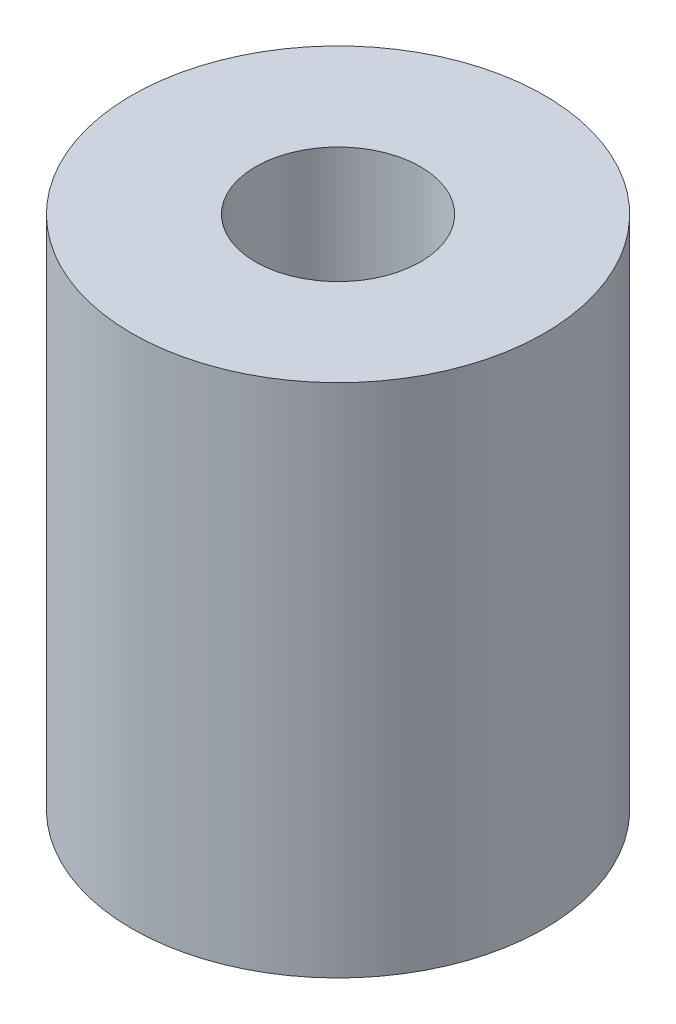
ISO-10303-21;
HEADER;
FILE_DESCRIPTION(('STEP AP214'),'2;1');
FILE_NAME('part.step','',(''),(''),'','','');
FILE_SCHEMA(('AUTOMOTIVE_DESIGN { 1 0 10303 214 1 1 1 1 }'));
ENDSEC;
DATA;
#1=APPLICATION_CONTEXT('core data for automotive mechanical design processes');
#2=APPLICATION_PROTOCOL_DEFINITION('international standard','automotive_design',2000,#1);
#3=PRODUCT_CONTEXT('',#1,'mechanical');
#4=PRODUCT('Part','Part','',(#3));
#5=PRODUCT_RELATED_PRODUCT_CATEGORY('part','',(#4));
#6=PRODUCT_DEFINITION_FORMATION('','',#4);
#7=PRODUCT_DEFINITION_CONTEXT('part definition',#1,'design');
#8=PRODUCT_DEFINITION('design','',#6,#7);
#9=PRODUCT_DEFINITION_SHAPE('','',#8);
#10=(LENGTH_UNIT() NAMED_UNIT(*) SI_UNIT(.MILLI.,.METRE.));
#11=(NAMED_UNIT(*) PLANE_ANGLE_UNIT() SI_UNIT($,.RADIAN.));
#12=(NAMED_UNIT(*) SI_UNIT($,.STERADIAN.) SOLID_ANGLE_UNIT());
#13=UNCERTAINTY_MEASURE_WITH_UNIT(LENGTH_MEASURE(1.E-05),#10,'distance_accuracy_value','');
#14=(GEOMETRIC_REPRESENTATION_CONTEXT(3) GLOBAL_UNCERTAINTY_ASSIGNED_CONTEXT((#13)) GLOBAL_UNIT_ASSIGNED_CONTEXT((#10,
#11,#12)) REPRESENTATION_CONTEXT('',''));
#15=CARTESIAN_POINT('',(0.,0.,0.));
#16=DIRECTION('',(0.,0.,1.));
#17=DIRECTION('',(1.,0.,0.));
#18=AXIS2_PLACEMENT_3D('',#15,#16,#17);
#19=CARTESIAN_POINT('',(0.,12.5,0.));
#20=DIRECTION('',(0.,1.,0.));
#21=DIRECTION('',(0.,0.,1.));
#22=AXIS2_PLACEMENT_3D('',#19,#20,#21);
#23=PLANE('',#22);
#24=CARTESIAN_POINT('',(0.,12.5,0.));
#25=DIRECTION('',(0.,1.,0.));
#26=DIRECTION('',(0.,0.,1.));
#27=AXIS2_PLACEMENT_3D('',#24,#25,#26);
#28=CIRCLE('',#27,2.5);
#29=CARTESIAN_POINT('',(0.,12.5,2.5));
#30=VERTEX_POINT('',#29);
#31=EDGE_CURVE('E41',#30,#30,#28,.T.);
#32=ORIENTED_EDGE('',*,*,#31,.F.);
#33=EDGE_LOOP('',(#32));
#34=FACE_BOUND('',#33,.T.);
#35=CARTESIAN_POINT('',(0.,12.5,0.));
#36=DIRECTION('',(0.,1.,0.));
#37=DIRECTION('',(0.,0.,1.));
#38=AXIS2_PLACEMENT_3D('',#35,#36,#37);
#39=CIRCLE('',#38,4.);
#40=CARTESIAN_POINT('',(0.,12.5,4.));
#41=VERTEX_POINT('',#40);
#42=EDGE_CURVE('E55',#41,#41,#39,.T.);
#43=ORIENTED_EDGE('',*,*,#42,.T.);
#44=EDGE_LOOP('',(#43));
#45=FACE_BOUND('',#44,.T.);
#46=ADVANCED_FACE('F34',(#34,#45),#23,.T.);
#47=CARTESIAN_POINT('',(0.,0.,0.));
#48=DIRECTION('',(0.,1.,0.));
#49=DIRECTION('',(0.,0.,1.));
#50=AXIS2_PLACEMENT_3D('',#47,#48,#49);
#51=PLANE('',#50);
#52=CARTESIAN_POINT('',(0.,0.,0.));
#53=DIRECTION('',(0.,1.,0.));
#54=DIRECTION('',(0.,0.,1.));
#55=AXIS2_PLACEMENT_3D('',#52,#53,#54);
#56=CIRCLE('',#55,10.);
#57=CARTESIAN_POINT('',(0.,0.,10.));
#58=VERTEX_POINT('',#57);
#59=EDGE_CURVE('E10',#58,#58,#56,.T.);
#60=ORIENTED_EDGE('',*,*,#59,.F.);
#61=EDGE_LOOP('',(#60));
#62=FACE_BOUND('',#61,.T.);
#63=CARTESIAN_POINT('',(0.,0.,0.));
#64=DIRECTION('',(0.,1.,0.));
#65=DIRECTION('',(0.,0.,1.));
#66=AXIS2_PLACEMENT_3D('',#63,#64,#65);
#67=CIRCLE('',#66,2.5);
#68=CARTESIAN_POINT('',(0.,0.,2.5));
#69=VERTEX_POINT('',#68);
#70=EDGE_CURVE('E45',#69,#69,#67,.T.);
#71=ORIENTED_EDGE('',*,*,#70,.T.);
#72=EDGE_LOOP('',(#71));
#73=FACE_BOUND('',#72,.T.);
#74=ADVANCED_FACE('F76',(#62,#73),#51,.F.);
#75=CARTESIAN_POINT('',(0.,12.5,0.));
#76=DIRECTION('',(0.,-1.,0.));
#77=DIRECTION('',(0.,0.,-1.));
#78=AXIS2_PLACEMENT_3D('',#75,#76,#77);
#79=CYLINDRICAL_SURFACE('',#78,10.);
#80=ORIENTED_EDGE('',*,*,#59,.T.);
#81=EDGE_LOOP('',(#80));
#82=FACE_BOUND('',#81,.T.);
#83=CARTESIAN_POINT('',(0.,25.,0.));
#84=DIRECTION('',(0.,1.,0.));
#85=DIRECTION('',(0.,0.,1.));
#86=AXIS2_PLACEMENT_3D('',#83,#84,#85);
#87=CIRCLE('',#86,10.);
#88=CARTESIAN_POINT('',(0.,25.,10.));
#89=VERTEX_POINT('',#88);
#90=EDGE_CURVE('E50',#89,#89,#87,.T.);
#91=ORIENTED_EDGE('',*,*,#90,.F.);
#92=EDGE_LOOP('',(#91));
#93=FACE_BOUND('',#92,.T.);
#94=ADVANCED_FACE('F36',(#82,#93),#79,.T.);
#95=CARTESIAN_POINT('',(0.,12.5,0.));
#96=DIRECTION('',(0.,-1.,0.));
#97=DIRECTION('',(0.,0.,-1.));
#98=AXIS2_PLACEMENT_3D('',#95,#96,#97);
#99=CYLINDRICAL_SURFACE('',#98,2.5);
#100=ORIENTED_EDGE('',*,*,#31,.T.);
#101=EDGE_LOOP('',(#100));
#102=FACE_BOUND('',#101,.T.);
#103=ORIENTED_EDGE('',*,*,#70,.F.);
#104=EDGE_LOOP('',(#103));
#105=FACE_BOUND('',#104,.T.);
#106=ADVANCED_FACE('F66',(#102,#105),#99,.F.);
#107=CARTESIAN_POINT('',(0.,25.,0.));
#108=DIRECTION('',(0.,1.,0.));
#109=DIRECTION('',(0.,0.,1.));
#110=AXIS2_PLACEMENT_3D('',#107,#108,#109);
#111=PLANE('',#110);
#112=ORIENTED_EDGE('',*,*,#90,.T.);
#113=EDGE_LOOP('',(#112));
#114=FACE_BOUND('',#113,.T.);
#115=CARTESIAN_POINT('',(0.,25.,0.));
#116=DIRECTION('',(0.,1.,0.));
#117=DIRECTION('',(0.,0.,1.));
#118=AXIS2_PLACEMENT_3D('',#115,#116,#117);
#119=CIRCLE('',#118,4.);
#120=CARTESIAN_POINT('',(0.,25.,4.));
#121=VERTEX_POINT('',#120);
#122=EDGE_CURVE('E54',#121,#121,#119,.T.);
#123=ORIENTED_EDGE('',*,*,#122,.F.);
#124=EDGE_LOOP('',(#123));
#125=FACE_BOUND('',#124,.T.);
#126=ADVANCED_FACE('F64',(#114,#125),#111,.T.);
#127=CARTESIAN_POINT('',(0.,25.,0.));
#128=DIRECTION('',(0.,-1.,0.));
#129=DIRECTION('',(0.,0.,-1.));
#130=AXIS2_PLACEMENT_3D('',#127,#128,#129);
#131=CYLINDRICAL_SURFACE('',#130,4.);
#132=ORIENTED_EDGE('',*,*,#122,.T.);
#133=EDGE_LOOP('',(#132));
#134=FACE_BOUND('',#133,.T.);
#135=ORIENTED_EDGE('',*,*,#42,.F.);
#136=EDGE_LOOP('',(#135));
#137=FACE_BOUND('',#136,.T.);
#138=ADVANCED_FACE('F61',(#134,#137),#131,.F.);
#139=CLOSED_SHELL('',(#46,#74,#94,#106,#126,#138));
#140=MANIFOLD_SOLID_BREP('B2',#139);
#141=ADVANCED_BREP_SHAPE_REPRESENTATION('',(#18,#140),#14);
#142=SHAPE_DEFINITION_REPRESENTATION(#9,#141);
ENDSEC;
END-ISO-10303-21;
